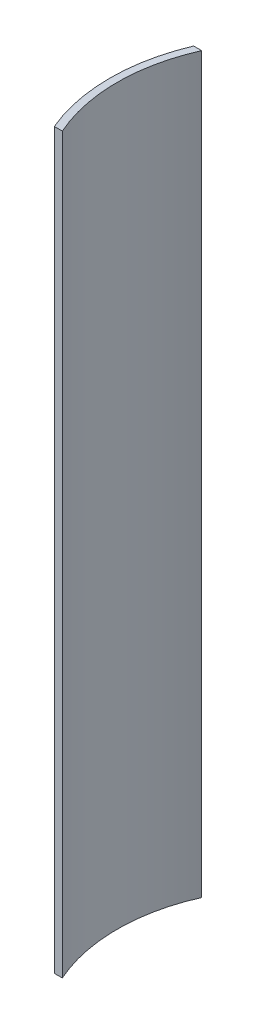
ISO-10303-21;
HEADER;
FILE_DESCRIPTION(('STEP AP214'),'2;1');
FILE_NAME('part.step','',(''),(''),'','','');
FILE_SCHEMA(('AUTOMOTIVE_DESIGN { 1 0 10303 214 1 1 1 1 }'));
ENDSEC;
DATA;
#1=APPLICATION_CONTEXT('core data for automotive mechanical design processes');
#2=APPLICATION_PROTOCOL_DEFINITION('international standard','automotive_design',2000,#1);
#3=PRODUCT_CONTEXT('',#1,'mechanical');
#4=PRODUCT('Part','Part','',(#3));
#5=PRODUCT_RELATED_PRODUCT_CATEGORY('part','',(#4));
#6=PRODUCT_DEFINITION_FORMATION('','',#4);
#7=PRODUCT_DEFINITION_CONTEXT('part definition',#1,'design');
#8=PRODUCT_DEFINITION('design','',#6,#7);
#9=PRODUCT_DEFINITION_SHAPE('','',#8);
#10=(LENGTH_UNIT() NAMED_UNIT(*) SI_UNIT(.MILLI.,.METRE.));
#11=(NAMED_UNIT(*) PLANE_ANGLE_UNIT() SI_UNIT($,.RADIAN.));
#12=(NAMED_UNIT(*) SI_UNIT($,.STERADIAN.) SOLID_ANGLE_UNIT());
#13=UNCERTAINTY_MEASURE_WITH_UNIT(LENGTH_MEASURE(1.E-05),#10,'distance_accuracy_value','');
#14=(GEOMETRIC_REPRESENTATION_CONTEXT(3) GLOBAL_UNCERTAINTY_ASSIGNED_CONTEXT((#13)) GLOBAL_UNIT_ASSIGNED_CONTEXT((#10,
#11,#12)) REPRESENTATION_CONTEXT('',''));
#15=CARTESIAN_POINT('',(0.,0.,0.));
#16=DIRECTION('',(0.,0.,1.));
#17=DIRECTION('',(1.,0.,0.));
#18=AXIS2_PLACEMENT_3D('',#15,#16,#17);
#19=CARTESIAN_POINT('',(-209.203280691194,1270.,149.283525345622));
#20=DIRECTION('',(0.,0.,-1.));
#21=DIRECTION('',(-1.,0.,0.));
#22=AXIS2_PLACEMENT_3D('',#19,#20,#21);
#23=PLANE('',#22);
#24=DIRECTION('',(0.,1.,0.));
#25=VECTOR('',#24,1.);
#26=CARTESIAN_POINT('',(13.6835039013126,-192.,149.283525345622));
#27=LINE('',#26,#25);
#28=CARTESIAN_POINT('',(13.6835039013125,0.,149.283525345622));
#29=VERTEX_POINT('',#28);
#30=CARTESIAN_POINT('',(13.6835039013125,1270.,149.283525345622));
#31=VERTEX_POINT('',#30);
#32=EDGE_CURVE('E102',#29,#31,#27,.T.);
#33=ORIENTED_EDGE('',*,*,#32,.F.);
#34=DIRECTION('',(1.,0.,0.));
#35=VECTOR('',#34,1.);
#36=CARTESIAN_POINT('',(-209.203280691194,0.,149.283525345622));
#37=LINE('',#36,#35);
#38=CARTESIAN_POINT('',(27.5270203006053,0.,149.283525345622));
#39=VERTEX_POINT('',#38);
#40=EDGE_CURVE('E99',#29,#39,#37,.T.);
#41=ORIENTED_EDGE('',*,*,#40,.T.);
#42=DIRECTION('',(0.,1.,0.));
#43=VECTOR('',#42,1.);
#44=CARTESIAN_POINT('',(27.5270203006053,-192.,149.283525345622));
#45=LINE('',#44,#43);
#46=CARTESIAN_POINT('',(27.5270203006053,1270.,149.283525345622));
#47=VERTEX_POINT('',#46);
#48=EDGE_CURVE('E51',#39,#47,#45,.T.);
#49=ORIENTED_EDGE('',*,*,#48,.T.);
#50=DIRECTION('',(1.,0.,0.));
#51=VECTOR('',#50,1.);
#52=CARTESIAN_POINT('',(-209.203280691194,1270.,149.283525345622));
#53=LINE('',#52,#51);
#54=EDGE_CURVE('E90',#31,#47,#53,.T.);
#55=ORIENTED_EDGE('',*,*,#54,.F.);
#56=EDGE_LOOP('',(#33,#41,#49,#55));
#57=FACE_BOUND('',#56,.T.);
#58=ADVANCED_FACE('F37',(#57),#23,.F.);
#59=CARTESIAN_POINT('',(-209.203280691194,1270.,-92.0164746543779));
#60=DIRECTION('',(0.,0.,1.));
#61=DIRECTION('',(1.,0.,0.));
#62=AXIS2_PLACEMENT_3D('',#59,#60,#61);
#63=PLANE('',#62);
#64=DIRECTION('',(0.,1.,0.));
#65=VECTOR('',#64,1.);
#66=CARTESIAN_POINT('',(13.6835039013126,-192.,-92.0164746543779));
#67=LINE('',#66,#65);
#68=CARTESIAN_POINT('',(13.6835039013125,1270.,-92.0164746543779));
#69=VERTEX_POINT('',#68);
#70=CARTESIAN_POINT('',(13.6835039013125,0.,-92.0164746543779));
#71=VERTEX_POINT('',#70);
#72=EDGE_CURVE('E58',#69,#71,#67,.F.);
#73=ORIENTED_EDGE('',*,*,#72,.F.);
#74=DIRECTION('',(-1.,0.,0.));
#75=VECTOR('',#74,1.);
#76=CARTESIAN_POINT('',(-209.203280691194,1270.,-92.0164746543779));
#77=LINE('',#76,#75);
#78=CARTESIAN_POINT('',(27.5270203006053,1270.,-92.0164746543779));
#79=VERTEX_POINT('',#78);
#80=EDGE_CURVE('E88',#79,#69,#77,.T.);
#81=ORIENTED_EDGE('',*,*,#80,.F.);
#82=DIRECTION('',(0.,1.,0.));
#83=VECTOR('',#82,1.);
#84=CARTESIAN_POINT('',(27.5270203006054,-192.,-92.0164746543779));
#85=LINE('',#84,#83);
#86=CARTESIAN_POINT('',(27.5270203006053,0.,-92.0164746543779));
#87=VERTEX_POINT('',#86);
#88=EDGE_CURVE('E74',#79,#87,#85,.F.);
#89=ORIENTED_EDGE('',*,*,#88,.T.);
#90=DIRECTION('',(-1.,0.,0.));
#91=VECTOR('',#90,1.);
#92=CARTESIAN_POINT('',(-209.203280691194,0.,-92.0164746543779));
#93=LINE('',#92,#91);
#94=EDGE_CURVE('E95',#87,#71,#93,.T.);
#95=ORIENTED_EDGE('',*,*,#94,.T.);
#96=EDGE_LOOP('',(#73,#81,#89,#95));
#97=FACE_BOUND('',#96,.T.);
#98=ADVANCED_FACE('F93',(#97),#63,.F.);
#99=CARTESIAN_POINT('',(0.,1270.,0.));
#100=DIRECTION('',(0.,1.,0.));
#101=DIRECTION('',(0.,0.,1.));
#102=AXIS2_PLACEMENT_3D('',#99,#100,#101);
#103=PLANE('',#102);
#104=ORIENTED_EDGE('',*,*,#80,.T.);
#105=CARTESIAN_POINT('',(298.796719308806,1270.,28.6335253456221));
#106=DIRECTION('',(0.,1.,0.));
#107=DIRECTION('',(0.,0.,1.));
#108=AXIS2_PLACEMENT_3D('',#105,#106,#107);
#109=CIRCLE('',#108,309.59);
#110=EDGE_CURVE('E91',#69,#31,#109,.T.);
#111=ORIENTED_EDGE('',*,*,#110,.T.);
#112=ORIENTED_EDGE('',*,*,#54,.T.);
#113=CARTESIAN_POINT('',(298.796719308806,1270.,28.6335253456221));
#114=DIRECTION('',(0.,1.,0.));
#115=DIRECTION('',(0.,0.,1.));
#116=AXIS2_PLACEMENT_3D('',#113,#114,#115);
#117=CIRCLE('',#116,296.89);
#118=EDGE_CURVE('E77',#79,#47,#117,.T.);
#119=ORIENTED_EDGE('',*,*,#118,.F.);
#120=EDGE_LOOP('',(#104,#111,#112,#119));
#121=FACE_BOUND('',#120,.T.);
#122=ADVANCED_FACE('F86',(#121),#103,.T.);
#123=CARTESIAN_POINT('',(0.,0.,0.));
#124=DIRECTION('',(0.,1.,0.));
#125=DIRECTION('',(0.,0.,1.));
#126=AXIS2_PLACEMENT_3D('',#123,#124,#125);
#127=PLANE('',#126);
#128=CARTESIAN_POINT('',(298.796719308806,0.,28.6335253456221));
#129=DIRECTION('',(0.,1.,0.));
#130=DIRECTION('',(0.,0.,1.));
#131=AXIS2_PLACEMENT_3D('',#128,#129,#130);
#132=CIRCLE('',#131,309.59);
#133=EDGE_CURVE('E12',#71,#29,#132,.T.);
#134=ORIENTED_EDGE('',*,*,#133,.F.);
#135=ORIENTED_EDGE('',*,*,#94,.F.);
#136=CARTESIAN_POINT('',(298.796719308806,0.,28.6335253456221));
#137=DIRECTION('',(0.,1.,0.));
#138=DIRECTION('',(0.,0.,1.));
#139=AXIS2_PLACEMENT_3D('',#136,#137,#138);
#140=CIRCLE('',#139,296.89);
#141=EDGE_CURVE('E44',#87,#39,#140,.T.);
#142=ORIENTED_EDGE('',*,*,#141,.T.);
#143=ORIENTED_EDGE('',*,*,#40,.F.);
#144=EDGE_LOOP('',(#134,#135,#142,#143));
#145=FACE_BOUND('',#144,.T.);
#146=ADVANCED_FACE('F104',(#145),#127,.F.);
#147=CARTESIAN_POINT('',(298.796719308806,-192.,28.6335253456221));
#148=DIRECTION('',(0.,1.,0.));
#149=DIRECTION('',(0.,0.,1.));
#150=AXIS2_PLACEMENT_3D('',#147,#148,#149);
#151=CYLINDRICAL_SURFACE('',#150,296.89);
#152=ORIENTED_EDGE('',*,*,#141,.F.);
#153=ORIENTED_EDGE('',*,*,#88,.F.);
#154=ORIENTED_EDGE('',*,*,#118,.T.);
#155=ORIENTED_EDGE('',*,*,#48,.F.);
#156=EDGE_LOOP('',(#152,#153,#154,#155));
#157=FACE_BOUND('',#156,.T.);
#158=ADVANCED_FACE('F76',(#157),#151,.F.);
#159=CARTESIAN_POINT('',(298.796719308806,-192.,28.6335253456221));
#160=DIRECTION('',(0.,1.,0.));
#161=DIRECTION('',(0.,0.,1.));
#162=AXIS2_PLACEMENT_3D('',#159,#160,#161);
#163=CYLINDRICAL_SURFACE('',#162,309.59);
#164=ORIENTED_EDGE('',*,*,#32,.T.);
#165=ORIENTED_EDGE('',*,*,#110,.F.);
#166=ORIENTED_EDGE('',*,*,#72,.T.);
#167=ORIENTED_EDGE('',*,*,#133,.T.);
#168=EDGE_LOOP('',(#164,#165,#166,#167));
#169=FACE_BOUND('',#168,.T.);
#170=ADVANCED_FACE('F107',(#169),#163,.T.);
#171=CLOSED_SHELL('',(#58,#98,#122,#146,#158,#170));
#172=MANIFOLD_SOLID_BREP('B2',#171);
#173=ADVANCED_BREP_SHAPE_REPRESENTATION('',(#18,#172),#14);
#174=SHAPE_DEFINITION_REPRESENTATION(#9,#173);
ENDSEC;
END-ISO-10303-21;
